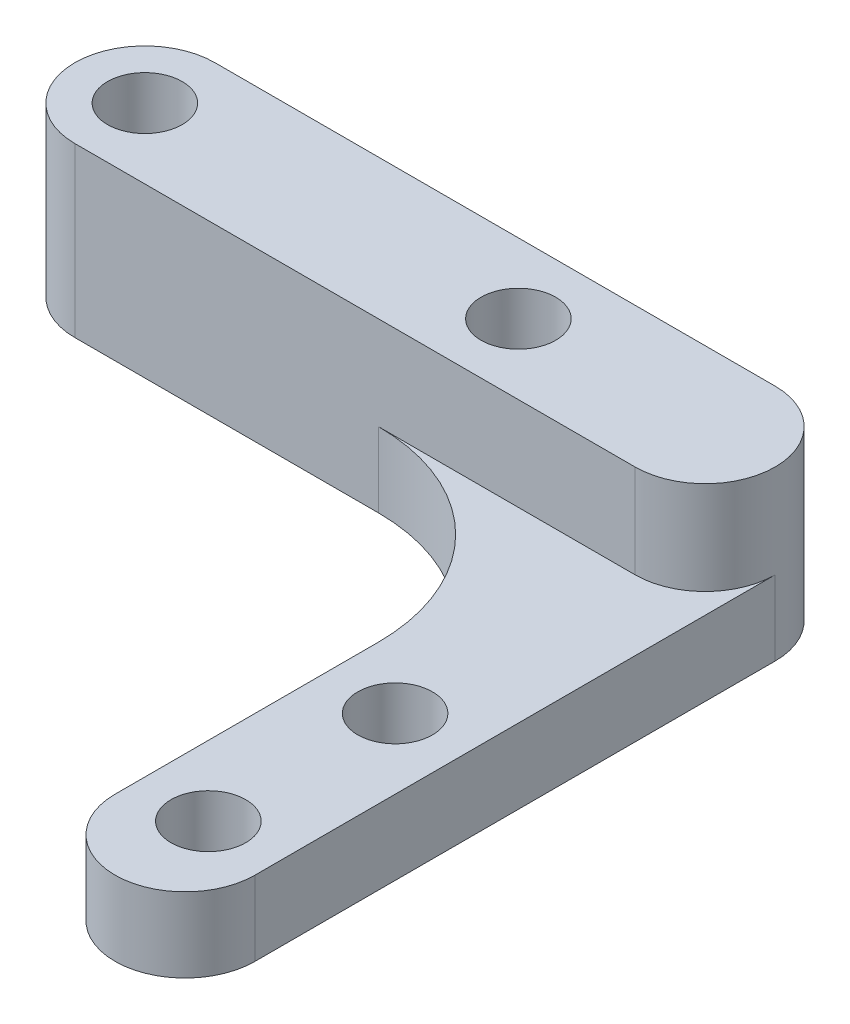
ISO-10303-21;
HEADER;
FILE_DESCRIPTION(('STEP AP214'),'2;1');
FILE_NAME('part.step','',(''),(''),'','','');
FILE_SCHEMA(('AUTOMOTIVE_DESIGN { 1 0 10303 214 1 1 1 1 }'));
ENDSEC;
DATA;
#1=APPLICATION_CONTEXT('core data for automotive mechanical design processes');
#2=APPLICATION_PROTOCOL_DEFINITION('international standard','automotive_design',2000,#1);
#3=PRODUCT_CONTEXT('',#1,'mechanical');
#4=PRODUCT('Part','Part','',(#3));
#5=PRODUCT_RELATED_PRODUCT_CATEGORY('part','',(#4));
#6=PRODUCT_DEFINITION_FORMATION('','',#4);
#7=PRODUCT_DEFINITION_CONTEXT('part definition',#1,'design');
#8=PRODUCT_DEFINITION('design','',#6,#7);
#9=PRODUCT_DEFINITION_SHAPE('','',#8);
#10=(LENGTH_UNIT() NAMED_UNIT(*) SI_UNIT(.MILLI.,.METRE.));
#11=(NAMED_UNIT(*) PLANE_ANGLE_UNIT() SI_UNIT($,.RADIAN.));
#12=(NAMED_UNIT(*) SI_UNIT($,.STERADIAN.) SOLID_ANGLE_UNIT());
#13=UNCERTAINTY_MEASURE_WITH_UNIT(LENGTH_MEASURE(1.E-05),#10,'distance_accuracy_value','');
#14=(GEOMETRIC_REPRESENTATION_CONTEXT(3) GLOBAL_UNCERTAINTY_ASSIGNED_CONTEXT((#13)) GLOBAL_UNIT_ASSIGNED_CONTEXT((#10,
#11,#12)) REPRESENTATION_CONTEXT('',''));
#15=CARTESIAN_POINT('',(0.,0.,0.));
#16=DIRECTION('',(0.,0.,1.));
#17=DIRECTION('',(1.,0.,0.));
#18=AXIS2_PLACEMENT_3D('',#15,#16,#17);
#19=CARTESIAN_POINT('',(-65.,-4.5,-67.1));
#20=DIRECTION('',(0.,1.,0.));
#21=DIRECTION('',(0.,0.,-1.));
#22=AXIS2_PLACEMENT_3D('',#19,#20,#21);
#23=PLANE('',#22);
#24=CARTESIAN_POINT('',(-80.,-4.5,-67.1));
#25=DIRECTION('',(0.,1.,0.));
#26=DIRECTION('',(0.,0.,-1.));
#27=AXIS2_PLACEMENT_3D('',#24,#25,#26);
#28=CIRCLE('',#27,2.);
#29=CARTESIAN_POINT('',(-80.,-4.5,-69.1));
#30=VERTEX_POINT('',#29);
#31=EDGE_CURVE('E176',#30,#30,#28,.T.);
#32=ORIENTED_EDGE('',*,*,#31,.F.);
#33=EDGE_LOOP('',(#32));
#34=FACE_BOUND('',#33,.T.);
#35=CARTESIAN_POINT('',(-60.,-4.5,-67.1));
#36=DIRECTION('',(0.,1.,0.));
#37=DIRECTION('',(0.,0.,-1.));
#38=AXIS2_PLACEMENT_3D('',#35,#36,#37);
#39=CIRCLE('',#38,2.);
#40=CARTESIAN_POINT('',(-60.,-4.5,-69.1));
#41=VERTEX_POINT('',#40);
#42=EDGE_CURVE('E168',#41,#41,#39,.T.);
#43=ORIENTED_EDGE('',*,*,#42,.F.);
#44=EDGE_LOOP('',(#43));
#45=FACE_BOUND('',#44,.T.);
#46=CARTESIAN_POINT('',(-50.,-4.5,-67.1));
#47=DIRECTION('',(0.,-1.,0.));
#48=DIRECTION('',(1.,0.,0.));
#49=AXIS2_PLACEMENT_3D('',#46,#47,#48);
#50=CIRCLE('',#49,3.75);
#51=CARTESIAN_POINT('',(-50.,-4.5,-70.85));
#52=VERTEX_POINT('',#51);
#53=CARTESIAN_POINT('',(-50.,-4.5,-63.35));
#54=VERTEX_POINT('',#53);
#55=EDGE_CURVE('E11',#52,#54,#50,.T.);
#56=ORIENTED_EDGE('',*,*,#55,.F.);
#57=DIRECTION('',(1.,0.,0.));
#58=VECTOR('',#57,1.);
#59=CARTESIAN_POINT('',(-50.,-4.5,-70.85));
#60=LINE('',#59,#58);
#61=CARTESIAN_POINT('',(-80.,-4.5,-70.85));
#62=VERTEX_POINT('',#61);
#63=EDGE_CURVE('E206',#62,#52,#60,.T.);
#64=ORIENTED_EDGE('',*,*,#63,.F.);
#65=CARTESIAN_POINT('',(-80.,-4.5,-67.1));
#66=DIRECTION('',(0.,-1.,0.));
#67=DIRECTION('',(0.,0.,-1.));
#68=AXIS2_PLACEMENT_3D('',#65,#66,#67);
#69=CIRCLE('',#68,3.75);
#70=CARTESIAN_POINT('',(-80.,-4.5,-63.35));
#71=VERTEX_POINT('',#70);
#72=EDGE_CURVE('E197',#71,#62,#69,.T.);
#73=ORIENTED_EDGE('',*,*,#72,.F.);
#74=DIRECTION('',(-1.,0.,0.));
#75=VECTOR('',#74,1.);
#76=CARTESIAN_POINT('',(-80.,-4.5,-63.35));
#77=LINE('',#76,#75);
#78=EDGE_CURVE('E26',#54,#71,#77,.T.);
#79=ORIENTED_EDGE('',*,*,#78,.F.);
#80=EDGE_LOOP('',(#56,#64,#73,#79));
#81=FACE_BOUND('',#80,.T.);
#82=ADVANCED_FACE('F17',(#34,#45,#81),#23,.T.);
#83=CARTESIAN_POINT('',(-50.,-9.,-67.1));
#84=DIRECTION('',(0.,-1.,0.));
#85=DIRECTION('',(1.,0.,0.));
#86=AXIS2_PLACEMENT_3D('',#83,#84,#85);
#87=CYLINDRICAL_SURFACE('',#86,3.75);
#88=DIRECTION('',(0.,-1.,0.));
#89=VECTOR('',#88,1.);
#90=CARTESIAN_POINT('',(-50.,-9.,-63.35));
#91=LINE('',#90,#89);
#92=CARTESIAN_POINT('',(-50.,-9.5,-63.35));
#93=VERTEX_POINT('',#92);
#94=EDGE_CURVE('E194',#54,#93,#91,.T.);
#95=ORIENTED_EDGE('',*,*,#94,.T.);
#96=CARTESIAN_POINT('',(-50.,-9.5,-67.1));
#97=DIRECTION('',(0.,-1.,0.));
#98=DIRECTION('',(1.,0.,0.));
#99=AXIS2_PLACEMENT_3D('',#96,#97,#98);
#100=CIRCLE('',#99,3.75);
#101=CARTESIAN_POINT('',(-46.25,-9.5,-67.1));
#102=VERTEX_POINT('',#101);
#103=EDGE_CURVE('E248',#102,#93,#100,.T.);
#104=ORIENTED_EDGE('',*,*,#103,.F.);
#105=DIRECTION('',(0.,-1.,0.));
#106=VECTOR('',#105,1.);
#107=CARTESIAN_POINT('',(-46.25,-9.,-67.1));
#108=LINE('',#107,#106);
#109=CARTESIAN_POINT('',(-46.25,-13.5,-67.1));
#110=VERTEX_POINT('',#109);
#111=EDGE_CURVE('E122',#102,#110,#108,.T.);
#112=ORIENTED_EDGE('',*,*,#111,.T.);
#113=CARTESIAN_POINT('',(-50.,-13.5,-67.1));
#114=DIRECTION('',(0.,1.,0.));
#115=DIRECTION('',(1.,0.,0.));
#116=AXIS2_PLACEMENT_3D('',#113,#114,#115);
#117=CIRCLE('',#116,3.75);
#118=CARTESIAN_POINT('',(-50.,-13.5,-70.85));
#119=VERTEX_POINT('',#118);
#120=EDGE_CURVE('E118',#110,#119,#117,.T.);
#121=ORIENTED_EDGE('',*,*,#120,.T.);
#122=DIRECTION('',(0.,-1.,0.));
#123=VECTOR('',#122,1.);
#124=CARTESIAN_POINT('',(-50.,-9.,-70.85));
#125=LINE('',#124,#123);
#126=EDGE_CURVE('E200',#52,#119,#125,.T.);
#127=ORIENTED_EDGE('',*,*,#126,.F.);
#128=ORIENTED_EDGE('',*,*,#55,.T.);
#129=EDGE_LOOP('',(#95,#104,#112,#121,#127,#128));
#130=FACE_BOUND('',#129,.T.);
#131=ADVANCED_FACE('F278',(#130),#87,.T.);
#132=CARTESIAN_POINT('',(-50.,-9.,-63.35));
#133=DIRECTION('',(0.,0.,-1.));
#134=DIRECTION('',(0.,-1.,0.));
#135=AXIS2_PLACEMENT_3D('',#132,#133,#134);
#136=PLANE('',#135);
#137=DIRECTION('',(0.,1.,0.));
#138=VECTOR('',#137,1.);
#139=CARTESIAN_POINT('',(-63.75,-9.,-63.35));
#140=LINE('',#139,#138);
#141=CARTESIAN_POINT('',(-63.75,-13.5,-63.35));
#142=VERTEX_POINT('',#141);
#143=CARTESIAN_POINT('',(-63.75,-9.5,-63.35));
#144=VERTEX_POINT('',#143);
#145=EDGE_CURVE('E179',#142,#144,#140,.T.);
#146=ORIENTED_EDGE('',*,*,#145,.T.);
#147=DIRECTION('',(-1.,0.,0.));
#148=VECTOR('',#147,1.);
#149=CARTESIAN_POINT('',(-80.,-9.5,-63.35));
#150=LINE('',#149,#148);
#151=EDGE_CURVE('E232',#93,#144,#150,.T.);
#152=ORIENTED_EDGE('',*,*,#151,.F.);
#153=ORIENTED_EDGE('',*,*,#94,.F.);
#154=ORIENTED_EDGE('',*,*,#78,.T.);
#155=DIRECTION('',(0.,-1.,0.));
#156=VECTOR('',#155,1.);
#157=CARTESIAN_POINT('',(-80.,-9.,-63.35));
#158=LINE('',#157,#156);
#159=CARTESIAN_POINT('',(-80.,-13.5,-63.35));
#160=VERTEX_POINT('',#159);
#161=EDGE_CURVE('E209',#71,#160,#158,.T.);
#162=ORIENTED_EDGE('',*,*,#161,.T.);
#163=DIRECTION('',(1.,0.,0.));
#164=VECTOR('',#163,1.);
#165=CARTESIAN_POINT('',(-80.,-13.5,-63.35));
#166=LINE('',#165,#164);
#167=EDGE_CURVE('E183',#160,#142,#166,.T.);
#168=ORIENTED_EDGE('',*,*,#167,.T.);
#169=EDGE_LOOP('',(#146,#152,#153,#154,#162,#168));
#170=FACE_BOUND('',#169,.T.);
#171=ADVANCED_FACE('F228',(#170),#136,.F.);
#172=CARTESIAN_POINT('',(-80.,-9.,-67.1));
#173=DIRECTION('',(0.,-1.,0.));
#174=DIRECTION('',(0.,0.,-1.));
#175=AXIS2_PLACEMENT_3D('',#172,#173,#174);
#176=CYLINDRICAL_SURFACE('',#175,3.75);
#177=DIRECTION('',(0.,-1.,0.));
#178=VECTOR('',#177,1.);
#179=CARTESIAN_POINT('',(-80.,-9.,-70.85));
#180=LINE('',#179,#178);
#181=CARTESIAN_POINT('',(-80.,-13.5,-70.85));
#182=VERTEX_POINT('',#181);
#183=EDGE_CURVE('E203',#62,#182,#180,.T.);
#184=ORIENTED_EDGE('',*,*,#183,.T.);
#185=CARTESIAN_POINT('',(-80.,-13.5,-67.1));
#186=DIRECTION('',(0.,1.,0.));
#187=DIRECTION('',(0.,0.,-1.));
#188=AXIS2_PLACEMENT_3D('',#185,#186,#187);
#189=CIRCLE('',#188,3.75);
#190=EDGE_CURVE('E186',#182,#160,#189,.T.);
#191=ORIENTED_EDGE('',*,*,#190,.T.);
#192=ORIENTED_EDGE('',*,*,#161,.F.);
#193=ORIENTED_EDGE('',*,*,#72,.T.);
#194=EDGE_LOOP('',(#184,#191,#192,#193));
#195=FACE_BOUND('',#194,.T.);
#196=ADVANCED_FACE('F19',(#195),#176,.T.);
#197=CARTESIAN_POINT('',(-80.,-9.,-70.85));
#198=DIRECTION('',(0.,0.,1.));
#199=DIRECTION('',(0.,-1.,0.));
#200=AXIS2_PLACEMENT_3D('',#197,#198,#199);
#201=PLANE('',#200);
#202=ORIENTED_EDGE('',*,*,#126,.T.);
#203=DIRECTION('',(-1.,0.,0.));
#204=VECTOR('',#203,1.);
#205=CARTESIAN_POINT('',(-50.,-13.5,-70.85));
#206=LINE('',#205,#204);
#207=EDGE_CURVE('E190',#119,#182,#206,.T.);
#208=ORIENTED_EDGE('',*,*,#207,.T.);
#209=ORIENTED_EDGE('',*,*,#183,.F.);
#210=ORIENTED_EDGE('',*,*,#63,.T.);
#211=EDGE_LOOP('',(#202,#208,#209,#210));
#212=FACE_BOUND('',#211,.T.);
#213=ADVANCED_FACE('F223',(#212),#201,.F.);
#214=CARTESIAN_POINT('',(-65.,-13.5,-53.175));
#215=DIRECTION('',(0.,1.,0.));
#216=DIRECTION('',(0.,0.,-1.));
#217=AXIS2_PLACEMENT_3D('',#214,#215,#216);
#218=PLANE('',#217);
#219=CARTESIAN_POINT('',(-80.,-13.5,-67.1));
#220=DIRECTION('',(0.,-1.,0.));
#221=DIRECTION('',(0.,0.,1.));
#222=AXIS2_PLACEMENT_3D('',#219,#220,#221);
#223=CIRCLE('',#222,2.);
#224=CARTESIAN_POINT('',(-80.,-13.5,-65.1));
#225=VERTEX_POINT('',#224);
#226=EDGE_CURVE('E172',#225,#225,#223,.T.);
#227=ORIENTED_EDGE('',*,*,#226,.F.);
#228=EDGE_LOOP('',(#227));
#229=FACE_BOUND('',#228,.T.);
#230=CARTESIAN_POINT('',(-60.,-13.5,-67.1));
#231=DIRECTION('',(0.,-1.,0.));
#232=DIRECTION('',(0.,0.,1.));
#233=AXIS2_PLACEMENT_3D('',#230,#231,#232);
#234=CIRCLE('',#233,2.);
#235=CARTESIAN_POINT('',(-60.,-13.5,-65.1));
#236=VERTEX_POINT('',#235);
#237=EDGE_CURVE('E164',#236,#236,#234,.T.);
#238=ORIENTED_EDGE('',*,*,#237,.F.);
#239=EDGE_LOOP('',(#238));
#240=FACE_BOUND('',#239,.T.);
#241=CARTESIAN_POINT('',(-50.,-13.5,-40.5));
#242=DIRECTION('',(0.,-1.,0.));
#243=DIRECTION('',(0.,0.,1.));
#244=AXIS2_PLACEMENT_3D('',#241,#242,#243);
#245=CIRCLE('',#244,2.);
#246=CARTESIAN_POINT('',(-50.,-13.5,-38.5));
#247=VERTEX_POINT('',#246);
#248=EDGE_CURVE('E160',#247,#247,#245,.T.);
#249=ORIENTED_EDGE('',*,*,#248,.F.);
#250=EDGE_LOOP('',(#249));
#251=FACE_BOUND('',#250,.T.);
#252=CARTESIAN_POINT('',(-50.,-13.5,-50.5));
#253=DIRECTION('',(0.,-1.,0.));
#254=DIRECTION('',(0.,0.,1.));
#255=AXIS2_PLACEMENT_3D('',#252,#253,#254);
#256=CIRCLE('',#255,2.);
#257=CARTESIAN_POINT('',(-50.,-13.5,-48.5));
#258=VERTEX_POINT('',#257);
#259=EDGE_CURVE('E159',#258,#258,#256,.T.);
#260=ORIENTED_EDGE('',*,*,#259,.F.);
#261=EDGE_LOOP('',(#260));
#262=FACE_BOUND('',#261,.T.);
#263=CARTESIAN_POINT('',(-50.,-13.5,-39.25));
#264=DIRECTION('',(0.,-1.,0.));
#265=DIRECTION('',(0.707106781186547,0.,0.707106781186548));
#266=AXIS2_PLACEMENT_3D('',#263,#264,#265);
#267=CIRCLE('',#266,3.75);
#268=CARTESIAN_POINT('',(-46.25,-13.5,-39.25));
#269=VERTEX_POINT('',#268);
#270=CARTESIAN_POINT('',(-53.75,-13.5,-39.25));
#271=VERTEX_POINT('',#270);
#272=EDGE_CURVE('E115',#269,#271,#267,.T.);
#273=ORIENTED_EDGE('',*,*,#272,.T.);
#274=DIRECTION('',(0.,0.,1.));
#275=VECTOR('',#274,1.);
#276=CARTESIAN_POINT('',(-53.75,-13.5,-67.1));
#277=LINE('',#276,#275);
#278=CARTESIAN_POINT('',(-53.75,-13.5,-53.35));
#279=VERTEX_POINT('',#278);
#280=EDGE_CURVE('E156',#279,#271,#277,.T.);
#281=ORIENTED_EDGE('',*,*,#280,.F.);
#282=CARTESIAN_POINT('',(-63.75,-13.5,-53.35));
#283=DIRECTION('',(0.,1.,0.));
#284=DIRECTION('',(0.707106781186548,0.,-0.707106781186548));
#285=AXIS2_PLACEMENT_3D('',#282,#283,#284);
#286=CIRCLE('',#285,10.);
#287=EDGE_CURVE('E123',#279,#142,#286,.T.);
#288=ORIENTED_EDGE('',*,*,#287,.T.);
#289=ORIENTED_EDGE('',*,*,#167,.F.);
#290=ORIENTED_EDGE('',*,*,#190,.F.);
#291=ORIENTED_EDGE('',*,*,#207,.F.);
#292=ORIENTED_EDGE('',*,*,#120,.F.);
#293=DIRECTION('',(0.,0.,-1.));
#294=VECTOR('',#293,1.);
#295=CARTESIAN_POINT('',(-46.25,-13.5,-55.5));
#296=LINE('',#295,#294);
#297=EDGE_CURVE('E110',#269,#110,#296,.T.);
#298=ORIENTED_EDGE('',*,*,#297,.F.);
#299=EDGE_LOOP('',(#273,#281,#288,#289,#290,#291,#292,#298));
#300=FACE_BOUND('',#299,.T.);
#301=ADVANCED_FACE('F112',(#229,#240,#251,#262,#300),#218,.F.);
#302=CARTESIAN_POINT('',(-46.25,-9.,-35.5));
#303=DIRECTION('',(-1.,0.,0.));
#304=DIRECTION('',(0.,1.,0.));
#305=AXIS2_PLACEMENT_3D('',#302,#303,#304);
#306=PLANE('',#305);
#307=DIRECTION('',(0.,-1.,0.));
#308=VECTOR('',#307,1.);
#309=CARTESIAN_POINT('',(-46.25,-9.,-39.25));
#310=LINE('',#309,#308);
#311=CARTESIAN_POINT('',(-46.25,-9.5,-39.25));
#312=VERTEX_POINT('',#311);
#313=EDGE_CURVE('E126',#312,#269,#310,.T.);
#314=ORIENTED_EDGE('',*,*,#313,.T.);
#315=ORIENTED_EDGE('',*,*,#297,.T.);
#316=ORIENTED_EDGE('',*,*,#111,.F.);
#317=DIRECTION('',(0.,0.,-1.));
#318=VECTOR('',#317,1.);
#319=CARTESIAN_POINT('',(-46.25,-9.5,-44.3375));
#320=LINE('',#319,#318);
#321=EDGE_CURVE('E129',#312,#102,#320,.T.);
#322=ORIENTED_EDGE('',*,*,#321,.F.);
#323=EDGE_LOOP('',(#314,#315,#316,#322));
#324=FACE_BOUND('',#323,.T.);
#325=ADVANCED_FACE('F127',(#324),#306,.F.);
#326=CARTESIAN_POINT('',(-63.75,-9.,-53.35));
#327=DIRECTION('',(0.,1.,0.));
#328=DIRECTION('',(0.707106781186548,0.,-0.707106781186548));
#329=AXIS2_PLACEMENT_3D('',#326,#327,#328);
#330=CYLINDRICAL_SURFACE('',#329,10.);
#331=CARTESIAN_POINT('',(-63.75,-9.5,-53.35));
#332=DIRECTION('',(0.,-1.,0.));
#333=DIRECTION('',(0.707106781186548,0.,-0.707106781186548));
#334=AXIS2_PLACEMENT_3D('',#331,#332,#333);
#335=CIRCLE('',#334,10.);
#336=CARTESIAN_POINT('',(-53.75,-9.5,-53.35));
#337=VERTEX_POINT('',#336);
#338=EDGE_CURVE('E238',#144,#337,#335,.T.);
#339=ORIENTED_EDGE('',*,*,#338,.F.);
#340=ORIENTED_EDGE('',*,*,#145,.F.);
#341=ORIENTED_EDGE('',*,*,#287,.F.);
#342=DIRECTION('',(0.,-1.,0.));
#343=VECTOR('',#342,1.);
#344=CARTESIAN_POINT('',(-53.75,-9.,-53.35));
#345=LINE('',#344,#343);
#346=EDGE_CURVE('E151',#337,#279,#345,.T.);
#347=ORIENTED_EDGE('',*,*,#346,.F.);
#348=EDGE_LOOP('',(#339,#340,#341,#347));
#349=FACE_BOUND('',#348,.T.);
#350=ADVANCED_FACE('F239',(#349),#330,.F.);
#351=CARTESIAN_POINT('',(-80.,-4.5,-67.1));
#352=DIRECTION('',(0.,-1.,0.));
#353=DIRECTION('',(0.,0.,-1.));
#354=AXIS2_PLACEMENT_3D('',#351,#352,#353);
#355=CYLINDRICAL_SURFACE('',#354,2.);
#356=ORIENTED_EDGE('',*,*,#31,.T.);
#357=EDGE_LOOP('',(#356));
#358=FACE_BOUND('',#357,.T.);
#359=ORIENTED_EDGE('',*,*,#226,.T.);
#360=EDGE_LOOP('',(#359));
#361=FACE_BOUND('',#360,.T.);
#362=ADVANCED_FACE('F294',(#358,#361),#355,.F.);
#363=CARTESIAN_POINT('',(-60.,-4.5,-67.1));
#364=DIRECTION('',(0.,-1.,0.));
#365=DIRECTION('',(0.,0.,-1.));
#366=AXIS2_PLACEMENT_3D('',#363,#364,#365);
#367=CYLINDRICAL_SURFACE('',#366,2.);
#368=ORIENTED_EDGE('',*,*,#42,.T.);
#369=EDGE_LOOP('',(#368));
#370=FACE_BOUND('',#369,.T.);
#371=ORIENTED_EDGE('',*,*,#237,.T.);
#372=EDGE_LOOP('',(#371));
#373=FACE_BOUND('',#372,.T.);
#374=ADVANCED_FACE('F299',(#370,#373),#367,.F.);
#375=CARTESIAN_POINT('',(-50.,-13.5,-40.5));
#376=DIRECTION('',(0.,1.,0.));
#377=DIRECTION('',(0.,0.,1.));
#378=AXIS2_PLACEMENT_3D('',#375,#376,#377);
#379=CYLINDRICAL_SURFACE('',#378,2.);
#380=ORIENTED_EDGE('',*,*,#248,.T.);
#381=EDGE_LOOP('',(#380));
#382=FACE_BOUND('',#381,.T.);
#383=CARTESIAN_POINT('',(-50.,-9.5,-40.5));
#384=DIRECTION('',(0.,1.,0.));
#385=DIRECTION('',(0.,0.,1.));
#386=AXIS2_PLACEMENT_3D('',#383,#384,#385);
#387=CIRCLE('',#386,2.);
#388=CARTESIAN_POINT('',(-50.,-9.5,-38.5));
#389=VERTEX_POINT('',#388);
#390=EDGE_CURVE('E139',#389,#389,#387,.T.);
#391=ORIENTED_EDGE('',*,*,#390,.T.);
#392=EDGE_LOOP('',(#391));
#393=FACE_BOUND('',#392,.T.);
#394=ADVANCED_FACE('F303',(#382,#393),#379,.F.);
#395=CARTESIAN_POINT('',(-50.,-13.5,-50.5));
#396=DIRECTION('',(0.,1.,0.));
#397=DIRECTION('',(0.,0.,1.));
#398=AXIS2_PLACEMENT_3D('',#395,#396,#397);
#399=CYLINDRICAL_SURFACE('',#398,2.);
#400=ORIENTED_EDGE('',*,*,#259,.T.);
#401=EDGE_LOOP('',(#400));
#402=FACE_BOUND('',#401,.T.);
#403=CARTESIAN_POINT('',(-50.,-9.5,-50.5));
#404=DIRECTION('',(0.,1.,0.));
#405=DIRECTION('',(0.,0.,1.));
#406=AXIS2_PLACEMENT_3D('',#403,#404,#405);
#407=CIRCLE('',#406,2.);
#408=CARTESIAN_POINT('',(-50.,-9.5,-48.5));
#409=VERTEX_POINT('',#408);
#410=EDGE_CURVE('E146',#409,#409,#407,.T.);
#411=ORIENTED_EDGE('',*,*,#410,.T.);
#412=EDGE_LOOP('',(#411));
#413=FACE_BOUND('',#412,.T.);
#414=ADVANCED_FACE('F264',(#402,#413),#399,.F.);
#415=CARTESIAN_POINT('',(-53.75,-9.,-63.35));
#416=DIRECTION('',(1.,0.,0.));
#417=DIRECTION('',(0.,0.,-1.));
#418=AXIS2_PLACEMENT_3D('',#415,#416,#417);
#419=PLANE('',#418);
#420=DIRECTION('',(0.,1.,0.));
#421=VECTOR('',#420,1.);
#422=CARTESIAN_POINT('',(-53.75,-9.,-39.25));
#423=LINE('',#422,#421);
#424=CARTESIAN_POINT('',(-53.75,-9.5,-39.25));
#425=VERTEX_POINT('',#424);
#426=EDGE_CURVE('E134',#271,#425,#423,.T.);
#427=ORIENTED_EDGE('',*,*,#426,.T.);
#428=DIRECTION('',(0.,0.,1.));
#429=VECTOR('',#428,1.);
#430=CARTESIAN_POINT('',(-53.75,-9.5,-58.2625));
#431=LINE('',#430,#429);
#432=EDGE_CURVE('E244',#337,#425,#431,.T.);
#433=ORIENTED_EDGE('',*,*,#432,.F.);
#434=ORIENTED_EDGE('',*,*,#346,.T.);
#435=ORIENTED_EDGE('',*,*,#280,.T.);
#436=EDGE_LOOP('',(#427,#433,#434,#435));
#437=FACE_BOUND('',#436,.T.);
#438=ADVANCED_FACE('F273',(#437),#419,.F.);
#439=CARTESIAN_POINT('',(-50.,-9.,-39.25));
#440=DIRECTION('',(0.,1.,0.));
#441=DIRECTION('',(-0.707106781186548,0.,0.707106781186547));
#442=AXIS2_PLACEMENT_3D('',#439,#440,#441);
#443=CYLINDRICAL_SURFACE('',#442,3.75);
#444=ORIENTED_EDGE('',*,*,#272,.F.);
#445=ORIENTED_EDGE('',*,*,#313,.F.);
#446=CARTESIAN_POINT('',(-50.,-9.5,-39.25));
#447=DIRECTION('',(0.,1.,0.));
#448=DIRECTION('',(0.707106781186547,0.,0.707106781186548));
#449=AXIS2_PLACEMENT_3D('',#446,#447,#448);
#450=CIRCLE('',#449,3.75);
#451=EDGE_CURVE('E324',#425,#312,#450,.T.);
#452=ORIENTED_EDGE('',*,*,#451,.F.);
#453=ORIENTED_EDGE('',*,*,#426,.F.);
#454=EDGE_LOOP('',(#444,#445,#452,#453));
#455=FACE_BOUND('',#454,.T.);
#456=ADVANCED_FACE('F137',(#455),#443,.T.);
#457=CARTESIAN_POINT('',(-65.,-9.5,-53.175));
#458=DIRECTION('',(0.,1.,0.));
#459=DIRECTION('',(0.,0.,-1.));
#460=AXIS2_PLACEMENT_3D('',#457,#458,#459);
#461=PLANE('',#460);
#462=ORIENTED_EDGE('',*,*,#390,.F.);
#463=EDGE_LOOP('',(#462));
#464=FACE_BOUND('',#463,.T.);
#465=ORIENTED_EDGE('',*,*,#410,.F.);
#466=EDGE_LOOP('',(#465));
#467=FACE_BOUND('',#466,.T.);
#468=ORIENTED_EDGE('',*,*,#451,.T.);
#469=ORIENTED_EDGE('',*,*,#321,.T.);
#470=ORIENTED_EDGE('',*,*,#103,.T.);
#471=ORIENTED_EDGE('',*,*,#151,.T.);
#472=ORIENTED_EDGE('',*,*,#338,.T.);
#473=ORIENTED_EDGE('',*,*,#432,.T.);
#474=EDGE_LOOP('',(#468,#469,#470,#471,#472,#473));
#475=FACE_BOUND('',#474,.T.);
#476=ADVANCED_FACE('F246',(#464,#467,#475),#461,.T.);
#477=CLOSED_SHELL('',(#82,#131,#171,#196,#213,#301,#325,#350,#362,#374,#394,#414,#438,#456,#476));
#478=MANIFOLD_SOLID_BREP('B1',#477);
#479=ADVANCED_BREP_SHAPE_REPRESENTATION('',(#18,#478),#14);
#480=SHAPE_DEFINITION_REPRESENTATION(#9,#479);
ENDSEC;
END-ISO-10303-21;
